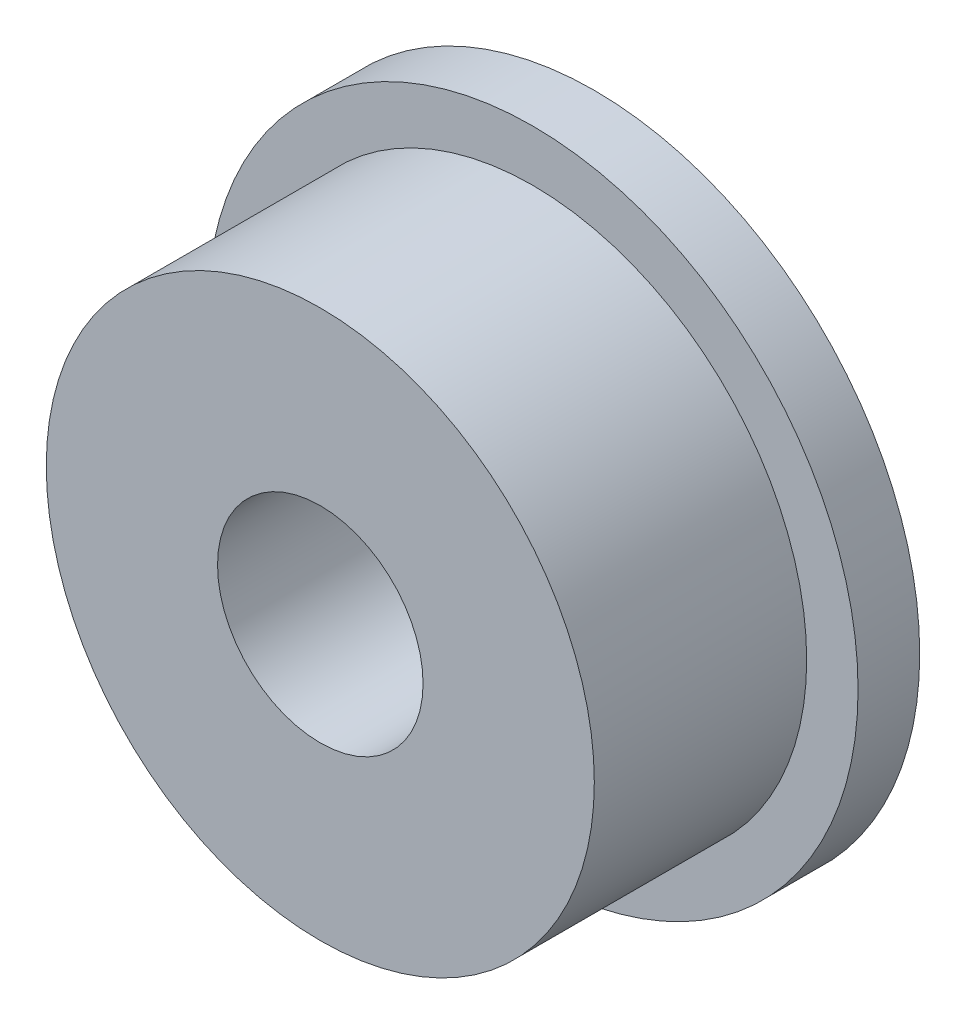
ISO-10303-21;
HEADER;
FILE_DESCRIPTION(('STEP AP214'),'2;1');
FILE_NAME('part.step','',(''),(''),'','','');
FILE_SCHEMA(('AUTOMOTIVE_DESIGN { 1 0 10303 214 1 1 1 1 }'));
ENDSEC;
DATA;
#1=APPLICATION_CONTEXT('core data for automotive mechanical design processes');
#2=APPLICATION_PROTOCOL_DEFINITION('international standard','automotive_design',2000,#1);
#3=PRODUCT_CONTEXT('',#1,'mechanical');
#4=PRODUCT('Part','Part','',(#3));
#5=PRODUCT_RELATED_PRODUCT_CATEGORY('part','',(#4));
#6=PRODUCT_DEFINITION_FORMATION('','',#4);
#7=PRODUCT_DEFINITION_CONTEXT('part definition',#1,'design');
#8=PRODUCT_DEFINITION('design','',#6,#7);
#9=PRODUCT_DEFINITION_SHAPE('','',#8);
#10=(LENGTH_UNIT() NAMED_UNIT(*) SI_UNIT(.MILLI.,.METRE.));
#11=(NAMED_UNIT(*) PLANE_ANGLE_UNIT() SI_UNIT($,.RADIAN.));
#12=(NAMED_UNIT(*) SI_UNIT($,.STERADIAN.) SOLID_ANGLE_UNIT());
#13=UNCERTAINTY_MEASURE_WITH_UNIT(LENGTH_MEASURE(1.E-05),#10,'distance_accuracy_value','');
#14=(GEOMETRIC_REPRESENTATION_CONTEXT(3) GLOBAL_UNCERTAINTY_ASSIGNED_CONTEXT((#13)) GLOBAL_UNIT_ASSIGNED_CONTEXT((#10,
#11,#12)) REPRESENTATION_CONTEXT('',''));
#15=CARTESIAN_POINT('',(0.,0.,0.));
#16=DIRECTION('',(0.,0.,1.));
#17=DIRECTION('',(1.,0.,0.));
#18=AXIS2_PLACEMENT_3D('',#15,#16,#17);
#19=CARTESIAN_POINT('',(0.,0.,1.));
#20=DIRECTION('',(0.,0.,1.));
#21=DIRECTION('',(1.,0.,0.));
#22=AXIS2_PLACEMENT_3D('',#19,#20,#21);
#23=PLANE('',#22);
#24=CARTESIAN_POINT('',(0.,0.,1.));
#25=DIRECTION('',(0.,0.,1.));
#26=DIRECTION('',(1.,0.,0.));
#27=AXIS2_PLACEMENT_3D('',#24,#25,#26);
#28=CIRCLE('',#27,4.);
#29=CARTESIAN_POINT('',(4.,0.,1.));
#30=VERTEX_POINT('',#29);
#31=EDGE_CURVE('E10',#30,#30,#28,.T.);
#32=ORIENTED_EDGE('',*,*,#31,.T.);
#33=EDGE_LOOP('',(#32));
#34=FACE_BOUND('',#33,.T.);
#35=CARTESIAN_POINT('',(0.,0.,1.));
#36=DIRECTION('',(0.,0.,1.));
#37=DIRECTION('',(1.,0.,0.));
#38=AXIS2_PLACEMENT_3D('',#35,#36,#37);
#39=CIRCLE('',#38,1.5);
#40=CARTESIAN_POINT('',(1.5,0.,1.));
#41=VERTEX_POINT('',#40);
#42=EDGE_CURVE('E46',#41,#41,#39,.T.);
#43=ORIENTED_EDGE('',*,*,#42,.F.);
#44=EDGE_LOOP('',(#43));
#45=FACE_BOUND('',#44,.T.);
#46=ADVANCED_FACE('F39',(#34,#45),#23,.T.);
#47=CARTESIAN_POINT('',(0.,0.,-3.));
#48=DIRECTION('',(0.,0.,1.));
#49=DIRECTION('',(1.,0.,0.));
#50=AXIS2_PLACEMENT_3D('',#47,#48,#49);
#51=PLANE('',#50);
#52=CARTESIAN_POINT('',(0.,0.,-3.));
#53=DIRECTION('',(0.,0.,1.));
#54=DIRECTION('',(1.,0.,0.));
#55=AXIS2_PLACEMENT_3D('',#52,#53,#54);
#56=CIRCLE('',#55,1.5);
#57=CARTESIAN_POINT('',(1.5,0.,-3.));
#58=VERTEX_POINT('',#57);
#59=EDGE_CURVE('E49',#58,#58,#56,.T.);
#60=ORIENTED_EDGE('',*,*,#59,.T.);
#61=EDGE_LOOP('',(#60));
#62=FACE_BOUND('',#61,.T.);
#63=CARTESIAN_POINT('',(0.,0.,-3.));
#64=DIRECTION('',(0.,0.,1.));
#65=DIRECTION('',(1.,0.,0.));
#66=AXIS2_PLACEMENT_3D('',#63,#64,#65);
#67=CIRCLE('',#66,4.75);
#68=CARTESIAN_POINT('',(4.75,0.,-3.));
#69=VERTEX_POINT('',#68);
#70=EDGE_CURVE('E58',#69,#69,#67,.T.);
#71=ORIENTED_EDGE('',*,*,#70,.F.);
#72=EDGE_LOOP('',(#71));
#73=FACE_BOUND('',#72,.T.);
#74=ADVANCED_FACE('F74',(#62,#73),#51,.F.);
#75=CARTESIAN_POINT('',(0.,0.,1.));
#76=DIRECTION('',(0.,0.,-1.));
#77=DIRECTION('',(-1.,0.,0.));
#78=AXIS2_PLACEMENT_3D('',#75,#76,#77);
#79=CYLINDRICAL_SURFACE('',#78,4.);
#80=CARTESIAN_POINT('',(0.,0.,-2.1));
#81=DIRECTION('',(0.,0.,1.));
#82=DIRECTION('',(1.,0.,0.));
#83=AXIS2_PLACEMENT_3D('',#80,#81,#82);
#84=CIRCLE('',#83,4.);
#85=CARTESIAN_POINT('',(4.,0.,-2.1));
#86=VERTEX_POINT('',#85);
#87=EDGE_CURVE('E54',#86,#86,#84,.T.);
#88=ORIENTED_EDGE('',*,*,#87,.T.);
#89=EDGE_LOOP('',(#88));
#90=FACE_BOUND('',#89,.T.);
#91=ORIENTED_EDGE('',*,*,#31,.F.);
#92=EDGE_LOOP('',(#91));
#93=FACE_BOUND('',#92,.T.);
#94=ADVANCED_FACE('F41',(#90,#93),#79,.T.);
#95=CARTESIAN_POINT('',(0.,0.,1.));
#96=DIRECTION('',(0.,0.,-1.));
#97=DIRECTION('',(-1.,0.,0.));
#98=AXIS2_PLACEMENT_3D('',#95,#96,#97);
#99=CYLINDRICAL_SURFACE('',#98,1.5);
#100=ORIENTED_EDGE('',*,*,#42,.T.);
#101=EDGE_LOOP('',(#100));
#102=FACE_BOUND('',#101,.T.);
#103=ORIENTED_EDGE('',*,*,#59,.F.);
#104=EDGE_LOOP('',(#103));
#105=FACE_BOUND('',#104,.T.);
#106=ADVANCED_FACE('F85',(#102,#105),#99,.F.);
#107=CARTESIAN_POINT('',(0.,0.,-2.1));
#108=DIRECTION('',(0.,0.,1.));
#109=DIRECTION('',(1.,0.,0.));
#110=AXIS2_PLACEMENT_3D('',#107,#108,#109);
#111=PLANE('',#110);
#112=CARTESIAN_POINT('',(0.,0.,-2.1));
#113=DIRECTION('',(0.,0.,1.));
#114=DIRECTION('',(1.,0.,0.));
#115=AXIS2_PLACEMENT_3D('',#112,#113,#114);
#116=CIRCLE('',#115,4.75);
#117=CARTESIAN_POINT('',(4.75,0.,-2.1));
#118=VERTEX_POINT('',#117);
#119=EDGE_CURVE('E56',#118,#118,#116,.T.);
#120=ORIENTED_EDGE('',*,*,#119,.T.);
#121=EDGE_LOOP('',(#120));
#122=FACE_BOUND('',#121,.T.);
#123=ORIENTED_EDGE('',*,*,#87,.F.);
#124=EDGE_LOOP('',(#123));
#125=FACE_BOUND('',#124,.T.);
#126=ADVANCED_FACE('F67',(#122,#125),#111,.T.);
#127=CARTESIAN_POINT('',(0.,0.,-2.1));
#128=DIRECTION('',(0.,0.,-1.));
#129=DIRECTION('',(-1.,0.,0.));
#130=AXIS2_PLACEMENT_3D('',#127,#128,#129);
#131=CYLINDRICAL_SURFACE('',#130,4.75);
#132=ORIENTED_EDGE('',*,*,#119,.F.);
#133=EDGE_LOOP('',(#132));
#134=FACE_BOUND('',#133,.T.);
#135=ORIENTED_EDGE('',*,*,#70,.T.);
#136=EDGE_LOOP('',(#135));
#137=FACE_BOUND('',#136,.T.);
#138=ADVANCED_FACE('F69',(#134,#137),#131,.T.);
#139=CLOSED_SHELL('',(#46,#74,#94,#106,#126,#138));
#140=MANIFOLD_SOLID_BREP('B2',#139);
#141=ADVANCED_BREP_SHAPE_REPRESENTATION('',(#18,#140),#14);
#142=SHAPE_DEFINITION_REPRESENTATION(#9,#141);
ENDSEC;
END-ISO-10303-21;
